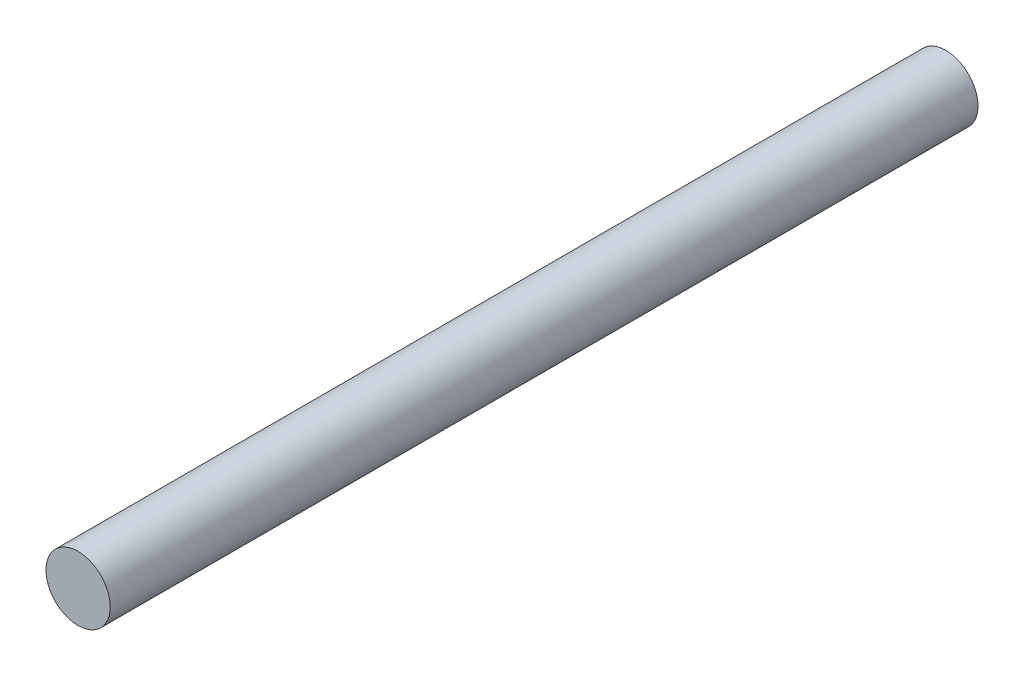
ISO-10303-21;
HEADER;
FILE_DESCRIPTION(('STEP AP214'),'2;1');
FILE_NAME('part.step','',(''),(''),'','','');
FILE_SCHEMA(('AUTOMOTIVE_DESIGN { 1 0 10303 214 1 1 1 1 }'));
ENDSEC;
DATA;
#1=APPLICATION_CONTEXT('core data for automotive mechanical design processes');
#2=APPLICATION_PROTOCOL_DEFINITION('international standard','automotive_design',2000,#1);
#3=PRODUCT_CONTEXT('',#1,'mechanical');
#4=PRODUCT('Part','Part','',(#3));
#5=PRODUCT_RELATED_PRODUCT_CATEGORY('part','',(#4));
#6=PRODUCT_DEFINITION_FORMATION('','',#4);
#7=PRODUCT_DEFINITION_CONTEXT('part definition',#1,'design');
#8=PRODUCT_DEFINITION('design','',#6,#7);
#9=PRODUCT_DEFINITION_SHAPE('','',#8);
#10=(LENGTH_UNIT() NAMED_UNIT(*) SI_UNIT(.MILLI.,.METRE.));
#11=(NAMED_UNIT(*) PLANE_ANGLE_UNIT() SI_UNIT($,.RADIAN.));
#12=(NAMED_UNIT(*) SI_UNIT($,.STERADIAN.) SOLID_ANGLE_UNIT());
#13=UNCERTAINTY_MEASURE_WITH_UNIT(LENGTH_MEASURE(1.E-05),#10,'distance_accuracy_value','');
#14=(GEOMETRIC_REPRESENTATION_CONTEXT(3) GLOBAL_UNCERTAINTY_ASSIGNED_CONTEXT((#13)) GLOBAL_UNIT_ASSIGNED_CONTEXT((#10,
#11,#12)) REPRESENTATION_CONTEXT('',''));
#15=CARTESIAN_POINT('',(0.,0.,0.));
#16=DIRECTION('',(0.,0.,1.));
#17=DIRECTION('',(1.,0.,0.));
#18=AXIS2_PLACEMENT_3D('',#15,#16,#17);
#19=CARTESIAN_POINT('',(0.,0.,685.8));
#20=DIRECTION('',(0.,0.,-1.));
#21=DIRECTION('',(-1.,0.,0.));
#22=AXIS2_PLACEMENT_3D('',#19,#20,#21);
#23=CYLINDRICAL_SURFACE('',#22,25.4);
#24=CARTESIAN_POINT('',(0.,0.,685.8));
#25=DIRECTION('',(0.,0.,1.));
#26=DIRECTION('',(1.,0.,0.));
#27=AXIS2_PLACEMENT_3D('',#24,#25,#26);
#28=CIRCLE('',#27,25.4);
#29=CARTESIAN_POINT('',(25.4,0.,685.8));
#30=VERTEX_POINT('',#29);
#31=EDGE_CURVE('E10',#30,#30,#28,.T.);
#32=ORIENTED_EDGE('',*,*,#31,.F.);
#33=EDGE_LOOP('',(#32));
#34=FACE_BOUND('',#33,.T.);
#35=CARTESIAN_POINT('',(0.,0.,0.));
#36=DIRECTION('',(0.,0.,1.));
#37=DIRECTION('',(1.,0.,0.));
#38=AXIS2_PLACEMENT_3D('',#35,#36,#37);
#39=CIRCLE('',#38,25.4);
#40=CARTESIAN_POINT('',(25.4,0.,0.));
#41=VERTEX_POINT('',#40);
#42=EDGE_CURVE('E35',#41,#41,#39,.T.);
#43=ORIENTED_EDGE('',*,*,#42,.T.);
#44=EDGE_LOOP('',(#43));
#45=FACE_BOUND('',#44,.T.);
#46=ADVANCED_FACE('F32',(#34,#45),#23,.T.);
#47=CARTESIAN_POINT('',(0.,0.,685.8));
#48=DIRECTION('',(0.,0.,1.));
#49=DIRECTION('',(1.,0.,0.));
#50=AXIS2_PLACEMENT_3D('',#47,#48,#49);
#51=PLANE('',#50);
#52=ORIENTED_EDGE('',*,*,#31,.T.);
#53=EDGE_LOOP('',(#52));
#54=FACE_BOUND('',#53,.T.);
#55=ADVANCED_FACE('F47',(#54),#51,.T.);
#56=CARTESIAN_POINT('',(0.,0.,0.));
#57=DIRECTION('',(0.,0.,1.));
#58=DIRECTION('',(1.,0.,0.));
#59=AXIS2_PLACEMENT_3D('',#56,#57,#58);
#60=PLANE('',#59);
#61=ORIENTED_EDGE('',*,*,#42,.F.);
#62=EDGE_LOOP('',(#61));
#63=FACE_BOUND('',#62,.T.);
#64=ADVANCED_FACE('F45',(#63),#60,.F.);
#65=CLOSED_SHELL('',(#46,#55,#64));
#66=MANIFOLD_SOLID_BREP('B2',#65);
#67=ADVANCED_BREP_SHAPE_REPRESENTATION('',(#18,#66),#14);
#68=SHAPE_DEFINITION_REPRESENTATION(#9,#67);
ENDSEC;
END-ISO-10303-21;
